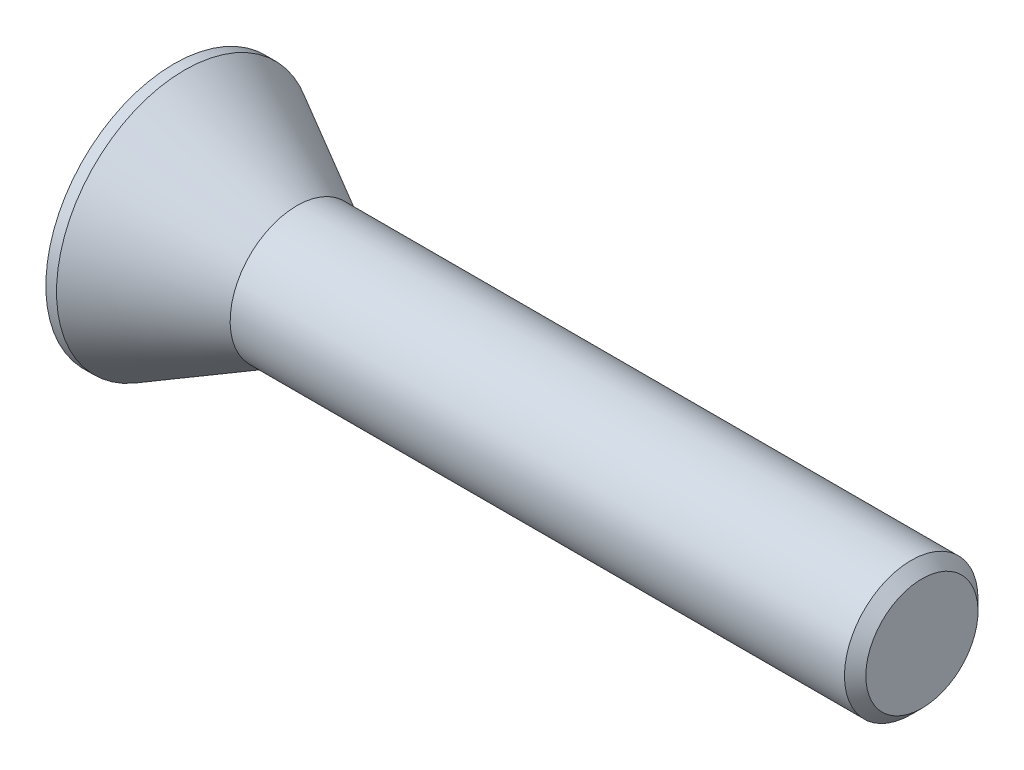
ISO-10303-21;
HEADER;
FILE_DESCRIPTION(('STEP AP214'),'2;1');
FILE_NAME('part.step','',(''),(''),'','','');
FILE_SCHEMA(('AUTOMOTIVE_DESIGN { 1 0 10303 214 1 1 1 1 }'));
ENDSEC;
DATA;
#1=APPLICATION_CONTEXT('core data for automotive mechanical design processes');
#2=APPLICATION_PROTOCOL_DEFINITION('international standard','automotive_design',2000,#1);
#3=PRODUCT_CONTEXT('',#1,'mechanical');
#4=PRODUCT('Part','Part','',(#3));
#5=PRODUCT_RELATED_PRODUCT_CATEGORY('part','',(#4));
#6=PRODUCT_DEFINITION_FORMATION('','',#4);
#7=PRODUCT_DEFINITION_CONTEXT('part definition',#1,'design');
#8=PRODUCT_DEFINITION('design','',#6,#7);
#9=PRODUCT_DEFINITION_SHAPE('','',#8);
#10=(LENGTH_UNIT() NAMED_UNIT(*) SI_UNIT(.MILLI.,.METRE.));
#11=(NAMED_UNIT(*) PLANE_ANGLE_UNIT() SI_UNIT($,.RADIAN.));
#12=(NAMED_UNIT(*) SI_UNIT($,.STERADIAN.) SOLID_ANGLE_UNIT());
#13=UNCERTAINTY_MEASURE_WITH_UNIT(LENGTH_MEASURE(1.E-05),#10,'distance_accuracy_value','');
#14=(GEOMETRIC_REPRESENTATION_CONTEXT(3) GLOBAL_UNCERTAINTY_ASSIGNED_CONTEXT((#13)) GLOBAL_UNIT_ASSIGNED_CONTEXT((#10,
#11,#12)) REPRESENTATION_CONTEXT('',''));
#15=CARTESIAN_POINT('',(0.,0.,0.));
#16=DIRECTION('',(0.,0.,1.));
#17=DIRECTION('',(1.,0.,0.));
#18=AXIS2_PLACEMENT_3D('',#15,#16,#17);
#19=CARTESIAN_POINT('',(0.,0.,0.));
#20=DIRECTION('',(1.,0.,0.));
#21=DIRECTION('',(0.,1.,0.));
#22=AXIS2_PLACEMENT_3D('',#19,#20,#21);
#23=PLANE('',#22);
#24=DIRECTION('',(0.,0.866025403784439,-0.5));
#25=VECTOR('',#24,1.);
#26=CARTESIAN_POINT('',(0.,0.,0.866025403784439));
#27=LINE('',#26,#25);
#28=CARTESIAN_POINT('',(0.,0.,0.866025403784439));
#29=VERTEX_POINT('',#28);
#30=CARTESIAN_POINT('',(0.,0.75,0.433012701892219));
#31=VERTEX_POINT('',#30);
#32=EDGE_CURVE('E136',#29,#31,#27,.T.);
#33=ORIENTED_EDGE('',*,*,#32,.F.);
#34=DIRECTION('',(0.,0.866025403784439,0.5));
#35=VECTOR('',#34,1.);
#36=CARTESIAN_POINT('',(0.,-0.75,0.43301270189222));
#37=LINE('',#36,#35);
#38=CARTESIAN_POINT('',(0.,-0.75,0.43301270189222));
#39=VERTEX_POINT('',#38);
#40=EDGE_CURVE('E62',#39,#29,#37,.T.);
#41=ORIENTED_EDGE('',*,*,#40,.F.);
#42=DIRECTION('',(0.,0.,1.));
#43=VECTOR('',#42,1.);
#44=CARTESIAN_POINT('',(0.,-0.75,-0.433012701892219));
#45=LINE('',#44,#43);
#46=CARTESIAN_POINT('',(0.,-0.75,-0.433012701892219));
#47=VERTEX_POINT('',#46);
#48=EDGE_CURVE('E145',#47,#39,#45,.T.);
#49=ORIENTED_EDGE('',*,*,#48,.F.);
#50=DIRECTION('',(0.,-0.866025403784438,0.5));
#51=VECTOR('',#50,1.);
#52=CARTESIAN_POINT('',(0.,0.,-0.866025403784439));
#53=LINE('',#52,#51);
#54=CARTESIAN_POINT('',(0.,0.,-0.866025403784439));
#55=VERTEX_POINT('',#54);
#56=EDGE_CURVE('E143',#55,#47,#53,.T.);
#57=ORIENTED_EDGE('',*,*,#56,.F.);
#58=DIRECTION('',(0.,-0.866025403784439,-0.5));
#59=VECTOR('',#58,1.);
#60=CARTESIAN_POINT('',(0.,0.75,-0.433012701892219));
#61=LINE('',#60,#59);
#62=CARTESIAN_POINT('',(0.,0.75,-0.433012701892219));
#63=VERTEX_POINT('',#62);
#64=EDGE_CURVE('E110',#63,#55,#61,.T.);
#65=ORIENTED_EDGE('',*,*,#64,.F.);
#66=DIRECTION('',(0.,0.,-1.));
#67=VECTOR('',#66,1.);
#68=CARTESIAN_POINT('',(0.,0.75,0.433012701892219));
#69=LINE('',#68,#67);
#70=EDGE_CURVE('E139',#31,#63,#69,.T.);
#71=ORIENTED_EDGE('',*,*,#70,.F.);
#72=EDGE_LOOP('',(#33,#41,#49,#57,#65,#71));
#73=FACE_BOUND('',#72,.T.);
#74=CARTESIAN_POINT('',(0.,0.,0.));
#75=DIRECTION('',(1.,0.,0.));
#76=DIRECTION('',(0.,1.,0.));
#77=AXIS2_PLACEMENT_3D('',#74,#75,#76);
#78=CIRCLE('',#77,2.4);
#79=CARTESIAN_POINT('',(0.,2.4,0.));
#80=VERTEX_POINT('',#79);
#81=EDGE_CURVE('E160',#80,#80,#78,.T.);
#82=ORIENTED_EDGE('',*,*,#81,.F.);
#83=EDGE_LOOP('',(#82));
#84=FACE_BOUND('',#83,.T.);
#85=ADVANCED_FACE('F46',(#73,#84),#23,.F.);
#86=CARTESIAN_POINT('',(14.,0.,0.));
#87=DIRECTION('',(1.,0.,0.));
#88=DIRECTION('',(0.,1.,0.));
#89=AXIS2_PLACEMENT_3D('',#86,#87,#88);
#90=CYLINDRICAL_SURFACE('',#89,2.4);
#91=CARTESIAN_POINT('',(0.200000000000001,0.,0.));
#92=DIRECTION('',(1.,0.,0.));
#93=DIRECTION('',(0.,1.,0.));
#94=AXIS2_PLACEMENT_3D('',#91,#92,#93);
#95=CIRCLE('',#94,2.4);
#96=CARTESIAN_POINT('',(0.200000000000001,2.4,0.));
#97=VERTEX_POINT('',#96);
#98=EDGE_CURVE('E157',#97,#97,#95,.T.);
#99=ORIENTED_EDGE('',*,*,#98,.F.);
#100=EDGE_LOOP('',(#99));
#101=FACE_BOUND('',#100,.T.);
#102=ORIENTED_EDGE('',*,*,#81,.T.);
#103=EDGE_LOOP('',(#102));
#104=FACE_BOUND('',#103,.T.);
#105=ADVANCED_FACE('F177',(#101,#104),#90,.T.);
#106=CARTESIAN_POINT('',(0.200000000000001,0.,0.));
#107=DIRECTION('',(-1.,0.,0.));
#108=DIRECTION('',(0.,-1.,0.));
#109=AXIS2_PLACEMENT_3D('',#106,#107,#108);
#110=CONICAL_SURFACE('',#109,2.4,0.50101338680359);
#111=CARTESIAN_POINT('',(2.3,0.,0.));
#112=DIRECTION('',(1.,0.,0.));
#113=DIRECTION('',(0.,1.,0.));
#114=AXIS2_PLACEMENT_3D('',#111,#112,#113);
#115=CIRCLE('',#114,1.25);
#116=CARTESIAN_POINT('',(2.3,1.25,0.));
#117=VERTEX_POINT('',#116);
#118=EDGE_CURVE('E149',#117,#117,#115,.T.);
#119=ORIENTED_EDGE('',*,*,#118,.F.);
#120=EDGE_LOOP('',(#119));
#121=FACE_BOUND('',#120,.T.);
#122=ORIENTED_EDGE('',*,*,#98,.T.);
#123=EDGE_LOOP('',(#122));
#124=FACE_BOUND('',#123,.T.);
#125=ADVANCED_FACE('F184',(#121,#124),#110,.T.);
#126=CARTESIAN_POINT('',(14.,0.,0.));
#127=DIRECTION('',(1.,0.,0.));
#128=DIRECTION('',(0.,1.,0.));
#129=AXIS2_PLACEMENT_3D('',#126,#127,#128);
#130=CYLINDRICAL_SURFACE('',#129,1.25);
#131=CARTESIAN_POINT('',(13.8,0.,0.));
#132=DIRECTION('',(-1.,0.,0.));
#133=DIRECTION('',(0.,-1.,0.));
#134=AXIS2_PLACEMENT_3D('',#131,#132,#133);
#135=CIRCLE('',#134,1.25);
#136=CARTESIAN_POINT('',(13.8,-1.25,0.));
#137=VERTEX_POINT('',#136);
#138=EDGE_CURVE('E11',#137,#137,#135,.T.);
#139=ORIENTED_EDGE('',*,*,#138,.T.);
#140=EDGE_LOOP('',(#139));
#141=FACE_BOUND('',#140,.T.);
#142=ORIENTED_EDGE('',*,*,#118,.T.);
#143=EDGE_LOOP('',(#142));
#144=FACE_BOUND('',#143,.T.);
#145=ADVANCED_FACE('F191',(#141,#144),#130,.T.);
#146=CARTESIAN_POINT('',(14.,-1.25,0.));
#147=DIRECTION('',(-1.,0.,0.));
#148=DIRECTION('',(0.,-1.,0.));
#149=AXIS2_PLACEMENT_3D('',#146,#147,#148);
#150=PLANE('',#149);
#151=CARTESIAN_POINT('',(14.,0.,0.));
#152=DIRECTION('',(-1.,0.,0.));
#153=DIRECTION('',(0.,-1.,0.));
#154=AXIS2_PLACEMENT_3D('',#151,#152,#153);
#155=CIRCLE('',#154,1.05);
#156=CARTESIAN_POINT('',(14.,-1.05,0.));
#157=VERTEX_POINT('',#156);
#158=EDGE_CURVE('E55',#157,#157,#155,.F.);
#159=ORIENTED_EDGE('',*,*,#158,.T.);
#160=EDGE_LOOP('',(#159));
#161=FACE_BOUND('',#160,.T.);
#162=ADVANCED_FACE('F165',(#161),#150,.F.);
#163=CARTESIAN_POINT('',(0.4,-0.75,0.43301270189222));
#164=DIRECTION('',(0.,-0.5,0.866025403784439));
#165=DIRECTION('',(0.,-0.866025403784439,-0.5));
#166=AXIS2_PLACEMENT_3D('',#163,#164,#165);
#167=PLANE('',#166);
#168=ORIENTED_EDGE('',*,*,#40,.T.);
#169=DIRECTION('',(-1.,0.,0.));
#170=VECTOR('',#169,1.);
#171=CARTESIAN_POINT('',(0.4,0.,0.866025403784439));
#172=LINE('',#171,#170);
#173=CARTESIAN_POINT('',(0.4,0.,0.866025403784439));
#174=VERTEX_POINT('',#173);
#175=EDGE_CURVE('E92',#174,#29,#172,.T.);
#176=ORIENTED_EDGE('',*,*,#175,.F.);
#177=DIRECTION('',(0.,0.866025403784439,0.5));
#178=VECTOR('',#177,1.);
#179=CARTESIAN_POINT('',(0.4,-0.75,0.43301270189222));
#180=LINE('',#179,#178);
#181=CARTESIAN_POINT('',(0.4,-0.75,0.43301270189222));
#182=VERTEX_POINT('',#181);
#183=EDGE_CURVE('E147',#182,#174,#180,.T.);
#184=ORIENTED_EDGE('',*,*,#183,.F.);
#185=DIRECTION('',(-1.,0.,0.));
#186=VECTOR('',#185,1.);
#187=CARTESIAN_POINT('',(0.4,-0.75,0.43301270189222));
#188=LINE('',#187,#186);
#189=EDGE_CURVE('E70',#182,#39,#188,.T.);
#190=ORIENTED_EDGE('',*,*,#189,.T.);
#191=EDGE_LOOP('',(#168,#176,#184,#190));
#192=FACE_BOUND('',#191,.T.);
#193=ADVANCED_FACE('F197',(#192),#167,.F.);
#194=CARTESIAN_POINT('',(0.4,-0.75,-0.433012701892219));
#195=DIRECTION('',(0.,-1.,0.));
#196=DIRECTION('',(1.,0.,0.));
#197=AXIS2_PLACEMENT_3D('',#194,#195,#196);
#198=PLANE('',#197);
#199=ORIENTED_EDGE('',*,*,#48,.T.);
#200=ORIENTED_EDGE('',*,*,#189,.F.);
#201=DIRECTION('',(0.,0.,1.));
#202=VECTOR('',#201,1.);
#203=CARTESIAN_POINT('',(0.4,-0.75,-0.433012701892219));
#204=LINE('',#203,#202);
#205=CARTESIAN_POINT('',(0.4,-0.75,-0.433012701892219));
#206=VERTEX_POINT('',#205);
#207=EDGE_CURVE('E122',#206,#182,#204,.T.);
#208=ORIENTED_EDGE('',*,*,#207,.F.);
#209=DIRECTION('',(-1.,0.,0.));
#210=VECTOR('',#209,1.);
#211=CARTESIAN_POINT('',(0.4,-0.75,-0.433012701892219));
#212=LINE('',#211,#210);
#213=EDGE_CURVE('E114',#206,#47,#212,.T.);
#214=ORIENTED_EDGE('',*,*,#213,.T.);
#215=EDGE_LOOP('',(#199,#200,#208,#214));
#216=FACE_BOUND('',#215,.T.);
#217=ADVANCED_FACE('F199',(#216),#198,.F.);
#218=CARTESIAN_POINT('',(0.4,0.,-0.866025403784439));
#219=DIRECTION('',(0.,-0.5,-0.866025403784438));
#220=DIRECTION('',(0.,0.866025403784438,-0.5));
#221=AXIS2_PLACEMENT_3D('',#218,#219,#220);
#222=PLANE('',#221);
#223=ORIENTED_EDGE('',*,*,#56,.T.);
#224=ORIENTED_EDGE('',*,*,#213,.F.);
#225=DIRECTION('',(0.,-0.866025403784438,0.5));
#226=VECTOR('',#225,1.);
#227=CARTESIAN_POINT('',(0.4,0.,-0.866025403784439));
#228=LINE('',#227,#226);
#229=CARTESIAN_POINT('',(0.4,0.,-0.866025403784439));
#230=VERTEX_POINT('',#229);
#231=EDGE_CURVE('E118',#230,#206,#228,.T.);
#232=ORIENTED_EDGE('',*,*,#231,.F.);
#233=DIRECTION('',(-1.,0.,0.));
#234=VECTOR('',#233,1.);
#235=CARTESIAN_POINT('',(0.4,0.,-0.866025403784439));
#236=LINE('',#235,#234);
#237=EDGE_CURVE('E103',#230,#55,#236,.T.);
#238=ORIENTED_EDGE('',*,*,#237,.T.);
#239=EDGE_LOOP('',(#223,#224,#232,#238));
#240=FACE_BOUND('',#239,.T.);
#241=ADVANCED_FACE('F119',(#240),#222,.F.);
#242=CARTESIAN_POINT('',(0.4,0.75,-0.433012701892219));
#243=DIRECTION('',(0.,0.5,-0.866025403784439));
#244=DIRECTION('',(0.,0.866025403784439,0.5));
#245=AXIS2_PLACEMENT_3D('',#242,#243,#244);
#246=PLANE('',#245);
#247=ORIENTED_EDGE('',*,*,#64,.T.);
#248=ORIENTED_EDGE('',*,*,#237,.F.);
#249=DIRECTION('',(0.,-0.866025403784439,-0.5));
#250=VECTOR('',#249,1.);
#251=CARTESIAN_POINT('',(0.4,0.75,-0.433012701892219));
#252=LINE('',#251,#250);
#253=CARTESIAN_POINT('',(0.4,0.75,-0.433012701892219));
#254=VERTEX_POINT('',#253);
#255=EDGE_CURVE('E107',#254,#230,#252,.T.);
#256=ORIENTED_EDGE('',*,*,#255,.F.);
#257=DIRECTION('',(-1.,0.,0.));
#258=VECTOR('',#257,1.);
#259=CARTESIAN_POINT('',(0.4,0.75,-0.433012701892219));
#260=LINE('',#259,#258);
#261=EDGE_CURVE('E115',#254,#63,#260,.T.);
#262=ORIENTED_EDGE('',*,*,#261,.T.);
#263=EDGE_LOOP('',(#247,#248,#256,#262));
#264=FACE_BOUND('',#263,.T.);
#265=ADVANCED_FACE('F105',(#264),#246,.F.);
#266=CARTESIAN_POINT('',(0.4,0.75,0.433012701892219));
#267=DIRECTION('',(0.,1.,0.));
#268=DIRECTION('',(-1.,0.,0.));
#269=AXIS2_PLACEMENT_3D('',#266,#267,#268);
#270=PLANE('',#269);
#271=ORIENTED_EDGE('',*,*,#70,.T.);
#272=ORIENTED_EDGE('',*,*,#261,.F.);
#273=DIRECTION('',(0.,0.,-1.));
#274=VECTOR('',#273,1.);
#275=CARTESIAN_POINT('',(0.4,0.75,0.433012701892219));
#276=LINE('',#275,#274);
#277=CARTESIAN_POINT('',(0.4,0.75,0.433012701892219));
#278=VERTEX_POINT('',#277);
#279=EDGE_CURVE('E128',#278,#254,#276,.T.);
#280=ORIENTED_EDGE('',*,*,#279,.F.);
#281=DIRECTION('',(-1.,0.,0.));
#282=VECTOR('',#281,1.);
#283=CARTESIAN_POINT('',(0.4,0.75,0.433012701892219));
#284=LINE('',#283,#282);
#285=EDGE_CURVE('E152',#278,#31,#284,.T.);
#286=ORIENTED_EDGE('',*,*,#285,.T.);
#287=EDGE_LOOP('',(#271,#272,#280,#286));
#288=FACE_BOUND('',#287,.T.);
#289=ADVANCED_FACE('F202',(#288),#270,.F.);
#290=CARTESIAN_POINT('',(0.4,0.,0.866025403784439));
#291=DIRECTION('',(0.,0.5,0.866025403784438));
#292=DIRECTION('',(0.,-0.866025403784439,0.5));
#293=AXIS2_PLACEMENT_3D('',#290,#291,#292);
#294=PLANE('',#293);
#295=ORIENTED_EDGE('',*,*,#32,.T.);
#296=ORIENTED_EDGE('',*,*,#285,.F.);
#297=DIRECTION('',(0.,0.866025403784439,-0.5));
#298=VECTOR('',#297,1.);
#299=CARTESIAN_POINT('',(0.4,0.,0.866025403784439));
#300=LINE('',#299,#298);
#301=EDGE_CURVE('E130',#174,#278,#300,.T.);
#302=ORIENTED_EDGE('',*,*,#301,.F.);
#303=ORIENTED_EDGE('',*,*,#175,.T.);
#304=EDGE_LOOP('',(#295,#296,#302,#303));
#305=FACE_BOUND('',#304,.T.);
#306=ADVANCED_FACE('F173',(#305),#294,.F.);
#307=CARTESIAN_POINT('',(0.4,0.,0.));
#308=DIRECTION('',(-1.,0.,0.));
#309=DIRECTION('',(0.,-1.,0.));
#310=AXIS2_PLACEMENT_3D('',#307,#308,#309);
#311=PLANE('',#310);
#312=ORIENTED_EDGE('',*,*,#183,.T.);
#313=ORIENTED_EDGE('',*,*,#301,.T.);
#314=ORIENTED_EDGE('',*,*,#279,.T.);
#315=ORIENTED_EDGE('',*,*,#255,.T.);
#316=ORIENTED_EDGE('',*,*,#231,.T.);
#317=ORIENTED_EDGE('',*,*,#207,.T.);
#318=EDGE_LOOP('',(#312,#313,#314,#315,#316,#317));
#319=FACE_BOUND('',#318,.T.);
#320=ADVANCED_FACE('F125',(#319),#311,.T.);
#321=CARTESIAN_POINT('',(14.,0.,0.));
#322=DIRECTION('',(-1.,0.,0.));
#323=DIRECTION('',(0.,-1.,0.));
#324=AXIS2_PLACEMENT_3D('',#321,#322,#323);
#325=CONICAL_SURFACE('',#324,1.05,0.785398163397445);
#326=ORIENTED_EDGE('',*,*,#138,.F.);
#327=EDGE_LOOP('',(#326));
#328=FACE_BOUND('',#327,.T.);
#329=ORIENTED_EDGE('',*,*,#158,.F.);
#330=EDGE_LOOP('',(#329));
#331=FACE_BOUND('',#330,.T.);
#332=ADVANCED_FACE('F49',(#328,#331),#325,.T.);
#333=CLOSED_SHELL('',(#85,#105,#125,#145,#162,#193,#217,#241,#265,#289,#306,#320,#332));
#334=MANIFOLD_SOLID_BREP('B2',#333);
#335=ADVANCED_BREP_SHAPE_REPRESENTATION('',(#18,#334),#14);
#336=SHAPE_DEFINITION_REPRESENTATION(#9,#335);
ENDSEC;
END-ISO-10303-21;
